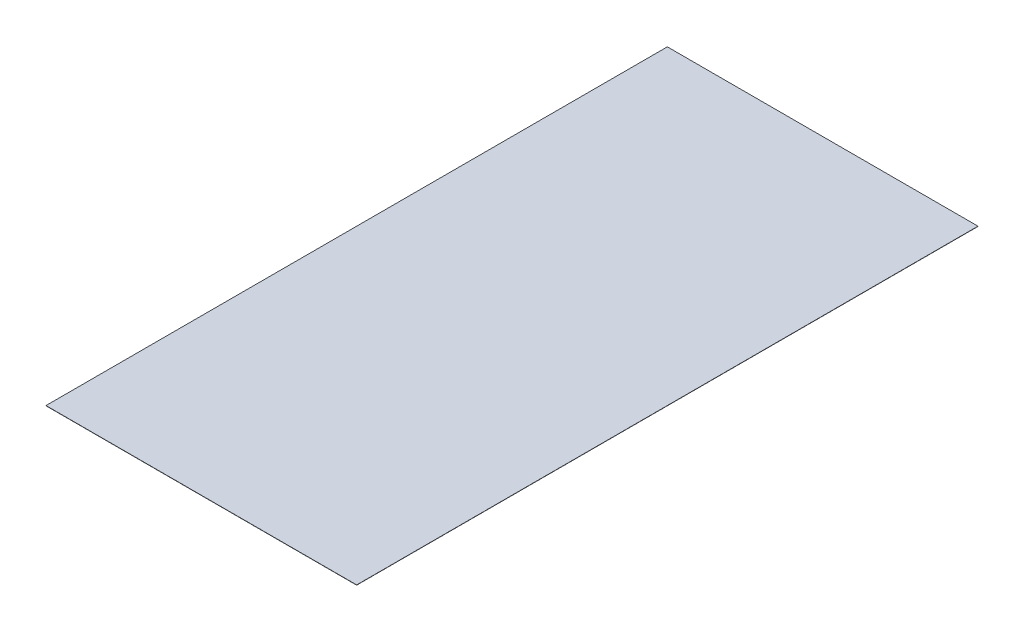
ISO-10303-21;
HEADER;
FILE_DESCRIPTION(('STEP AP214'),'2;1');
FILE_NAME('part.step','',(''),(''),'','','');
FILE_SCHEMA(('AUTOMOTIVE_DESIGN { 1 0 10303 214 1 1 1 1 }'));
ENDSEC;
DATA;
#1=APPLICATION_CONTEXT('core data for automotive mechanical design processes');
#2=APPLICATION_PROTOCOL_DEFINITION('international standard','automotive_design',2000,#1);
#3=PRODUCT_CONTEXT('',#1,'mechanical');
#4=PRODUCT('Part','Part','',(#3));
#5=PRODUCT_RELATED_PRODUCT_CATEGORY('part','',(#4));
#6=PRODUCT_DEFINITION_FORMATION('','',#4);
#7=PRODUCT_DEFINITION_CONTEXT('part definition',#1,'design');
#8=PRODUCT_DEFINITION('design','',#6,#7);
#9=PRODUCT_DEFINITION_SHAPE('','',#8);
#10=(LENGTH_UNIT() NAMED_UNIT(*) SI_UNIT(.MILLI.,.METRE.));
#11=(NAMED_UNIT(*) PLANE_ANGLE_UNIT() SI_UNIT($,.RADIAN.));
#12=(NAMED_UNIT(*) SI_UNIT($,.STERADIAN.) SOLID_ANGLE_UNIT());
#13=UNCERTAINTY_MEASURE_WITH_UNIT(LENGTH_MEASURE(1.E-05),#10,'distance_accuracy_value','');
#14=(GEOMETRIC_REPRESENTATION_CONTEXT(3) GLOBAL_UNCERTAINTY_ASSIGNED_CONTEXT((#13)) GLOBAL_UNIT_ASSIGNED_CONTEXT((#10,
#11,#12)) REPRESENTATION_CONTEXT('',''));
#15=CARTESIAN_POINT('',(0.,0.,0.));
#16=DIRECTION('',(0.,0.,1.));
#17=DIRECTION('',(1.,0.,0.));
#18=AXIS2_PLACEMENT_3D('',#15,#16,#17);
#19=CARTESIAN_POINT('',(609.6,0.912,-1219.2));
#20=DIRECTION('',(-1.,0.,0.));
#21=DIRECTION('',(0.,0.,1.));
#22=AXIS2_PLACEMENT_3D('',#19,#20,#21);
#23=PLANE('',#22);
#24=DIRECTION('',(0.,0.,-1.));
#25=VECTOR('',#24,1.);
#26=CARTESIAN_POINT('',(609.6,0.,-1219.2));
#27=LINE('',#26,#25);
#28=CARTESIAN_POINT('',(609.6,0.,1219.2));
#29=VERTEX_POINT('',#28);
#30=CARTESIAN_POINT('',(609.6,0.,-1219.2));
#31=VERTEX_POINT('',#30);
#32=EDGE_CURVE('E96',#29,#31,#27,.T.);
#33=ORIENTED_EDGE('',*,*,#32,.T.);
#34=DIRECTION('',(0.,-1.,0.));
#35=VECTOR('',#34,1.);
#36=CARTESIAN_POINT('',(609.6,0.912,-1219.2));
#37=LINE('',#36,#35);
#38=CARTESIAN_POINT('',(609.6,0.912,-1219.2));
#39=VERTEX_POINT('',#38);
#40=EDGE_CURVE('E11',#39,#31,#37,.T.);
#41=ORIENTED_EDGE('',*,*,#40,.F.);
#42=DIRECTION('',(0.,0.,-1.));
#43=VECTOR('',#42,1.);
#44=CARTESIAN_POINT('',(609.6,0.912,-1219.2));
#45=LINE('',#44,#43);
#46=CARTESIAN_POINT('',(609.6,0.912,1219.2));
#47=VERTEX_POINT('',#46);
#48=EDGE_CURVE('E84',#47,#39,#45,.T.);
#49=ORIENTED_EDGE('',*,*,#48,.F.);
#50=DIRECTION('',(0.,-1.,0.));
#51=VECTOR('',#50,1.);
#52=CARTESIAN_POINT('',(609.6,0.912,1219.2));
#53=LINE('',#52,#51);
#54=EDGE_CURVE('E92',#47,#29,#53,.T.);
#55=ORIENTED_EDGE('',*,*,#54,.T.);
#56=EDGE_LOOP('',(#33,#41,#49,#55));
#57=FACE_BOUND('',#56,.T.);
#58=ADVANCED_FACE('F33',(#57),#23,.F.);
#59=CARTESIAN_POINT('',(-609.6,0.912,-1219.2));
#60=DIRECTION('',(0.,0.,1.));
#61=DIRECTION('',(1.,0.,0.));
#62=AXIS2_PLACEMENT_3D('',#59,#60,#61);
#63=PLANE('',#62);
#64=DIRECTION('',(-1.,0.,0.));
#65=VECTOR('',#64,1.);
#66=CARTESIAN_POINT('',(-609.6,0.,-1219.2));
#67=LINE('',#66,#65);
#68=CARTESIAN_POINT('',(-609.6,0.,-1219.2));
#69=VERTEX_POINT('',#68);
#70=EDGE_CURVE('E88',#31,#69,#67,.T.);
#71=ORIENTED_EDGE('',*,*,#70,.T.);
#72=DIRECTION('',(0.,-1.,0.));
#73=VECTOR('',#72,1.);
#74=CARTESIAN_POINT('',(-609.6,0.912,-1219.2));
#75=LINE('',#74,#73);
#76=CARTESIAN_POINT('',(-609.6,0.912,-1219.2));
#77=VERTEX_POINT('',#76);
#78=EDGE_CURVE('E41',#77,#69,#75,.T.);
#79=ORIENTED_EDGE('',*,*,#78,.F.);
#80=DIRECTION('',(-1.,0.,0.));
#81=VECTOR('',#80,1.);
#82=CARTESIAN_POINT('',(-609.6,0.912,-1219.2));
#83=LINE('',#82,#81);
#84=EDGE_CURVE('E79',#39,#77,#83,.T.);
#85=ORIENTED_EDGE('',*,*,#84,.F.);
#86=ORIENTED_EDGE('',*,*,#40,.T.);
#87=EDGE_LOOP('',(#71,#79,#85,#86));
#88=FACE_BOUND('',#87,.T.);
#89=ADVANCED_FACE('F87',(#88),#63,.F.);
#90=CARTESIAN_POINT('',(-609.6,0.912,-1219.2));
#91=DIRECTION('',(1.,0.,0.));
#92=DIRECTION('',(0.,0.,-1.));
#93=AXIS2_PLACEMENT_3D('',#90,#91,#92);
#94=PLANE('',#93);
#95=DIRECTION('',(0.,0.,1.));
#96=VECTOR('',#95,1.);
#97=CARTESIAN_POINT('',(-609.6,0.,-1219.2));
#98=LINE('',#97,#96);
#99=CARTESIAN_POINT('',(-609.6,0.,1219.2));
#100=VERTEX_POINT('',#99);
#101=EDGE_CURVE('E66',#69,#100,#98,.T.);
#102=ORIENTED_EDGE('',*,*,#101,.T.);
#103=DIRECTION('',(0.,-1.,0.));
#104=VECTOR('',#103,1.);
#105=CARTESIAN_POINT('',(-609.6,0.912,1219.2));
#106=LINE('',#105,#104);
#107=CARTESIAN_POINT('',(-609.6,0.912,1219.2));
#108=VERTEX_POINT('',#107);
#109=EDGE_CURVE('E89',#108,#100,#106,.T.);
#110=ORIENTED_EDGE('',*,*,#109,.F.);
#111=DIRECTION('',(0.,0.,1.));
#112=VECTOR('',#111,1.);
#113=CARTESIAN_POINT('',(-609.6,0.912,-1219.2));
#114=LINE('',#113,#112);
#115=EDGE_CURVE('E82',#77,#108,#114,.T.);
#116=ORIENTED_EDGE('',*,*,#115,.F.);
#117=ORIENTED_EDGE('',*,*,#78,.T.);
#118=EDGE_LOOP('',(#102,#110,#116,#117));
#119=FACE_BOUND('',#118,.T.);
#120=ADVANCED_FACE('F90',(#119),#94,.F.);
#121=CARTESIAN_POINT('',(-609.6,0.912,1219.2));
#122=DIRECTION('',(0.,0.,-1.));
#123=DIRECTION('',(-1.,0.,0.));
#124=AXIS2_PLACEMENT_3D('',#121,#122,#123);
#125=PLANE('',#124);
#126=DIRECTION('',(1.,0.,0.));
#127=VECTOR('',#126,1.);
#128=CARTESIAN_POINT('',(-609.6,0.,1219.2));
#129=LINE('',#128,#127);
#130=EDGE_CURVE('E72',#100,#29,#129,.T.);
#131=ORIENTED_EDGE('',*,*,#130,.T.);
#132=ORIENTED_EDGE('',*,*,#54,.F.);
#133=DIRECTION('',(1.,0.,0.));
#134=VECTOR('',#133,1.);
#135=CARTESIAN_POINT('',(-609.6,0.912,1219.2));
#136=LINE('',#135,#134);
#137=EDGE_CURVE('E49',#108,#47,#136,.T.);
#138=ORIENTED_EDGE('',*,*,#137,.F.);
#139=ORIENTED_EDGE('',*,*,#109,.T.);
#140=EDGE_LOOP('',(#131,#132,#138,#139));
#141=FACE_BOUND('',#140,.T.);
#142=ADVANCED_FACE('F103',(#141),#125,.F.);
#143=CARTESIAN_POINT('',(0.,0.912,0.));
#144=DIRECTION('',(0.,1.,0.));
#145=DIRECTION('',(0.,0.,1.));
#146=AXIS2_PLACEMENT_3D('',#143,#144,#145);
#147=PLANE('',#146);
#148=ORIENTED_EDGE('',*,*,#48,.T.);
#149=ORIENTED_EDGE('',*,*,#84,.T.);
#150=ORIENTED_EDGE('',*,*,#115,.T.);
#151=ORIENTED_EDGE('',*,*,#137,.T.);
#152=EDGE_LOOP('',(#148,#149,#150,#151));
#153=FACE_BOUND('',#152,.T.);
#154=ADVANCED_FACE('F80',(#153),#147,.T.);
#155=CARTESIAN_POINT('',(0.,0.,0.));
#156=DIRECTION('',(0.,1.,0.));
#157=DIRECTION('',(0.,0.,1.));
#158=AXIS2_PLACEMENT_3D('',#155,#156,#157);
#159=PLANE('',#158);
#160=ORIENTED_EDGE('',*,*,#32,.F.);
#161=ORIENTED_EDGE('',*,*,#130,.F.);
#162=ORIENTED_EDGE('',*,*,#101,.F.);
#163=ORIENTED_EDGE('',*,*,#70,.F.);
#164=EDGE_LOOP('',(#160,#161,#162,#163));
#165=FACE_BOUND('',#164,.T.);
#166=ADVANCED_FACE('F106',(#165),#159,.F.);
#167=CLOSED_SHELL('',(#58,#89,#120,#142,#154,#166));
#168=MANIFOLD_SOLID_BREP('B2',#167);
#169=ADVANCED_BREP_SHAPE_REPRESENTATION('',(#18,#168),#14);
#170=SHAPE_DEFINITION_REPRESENTATION(#9,#169);
ENDSEC;
END-ISO-10303-21;
